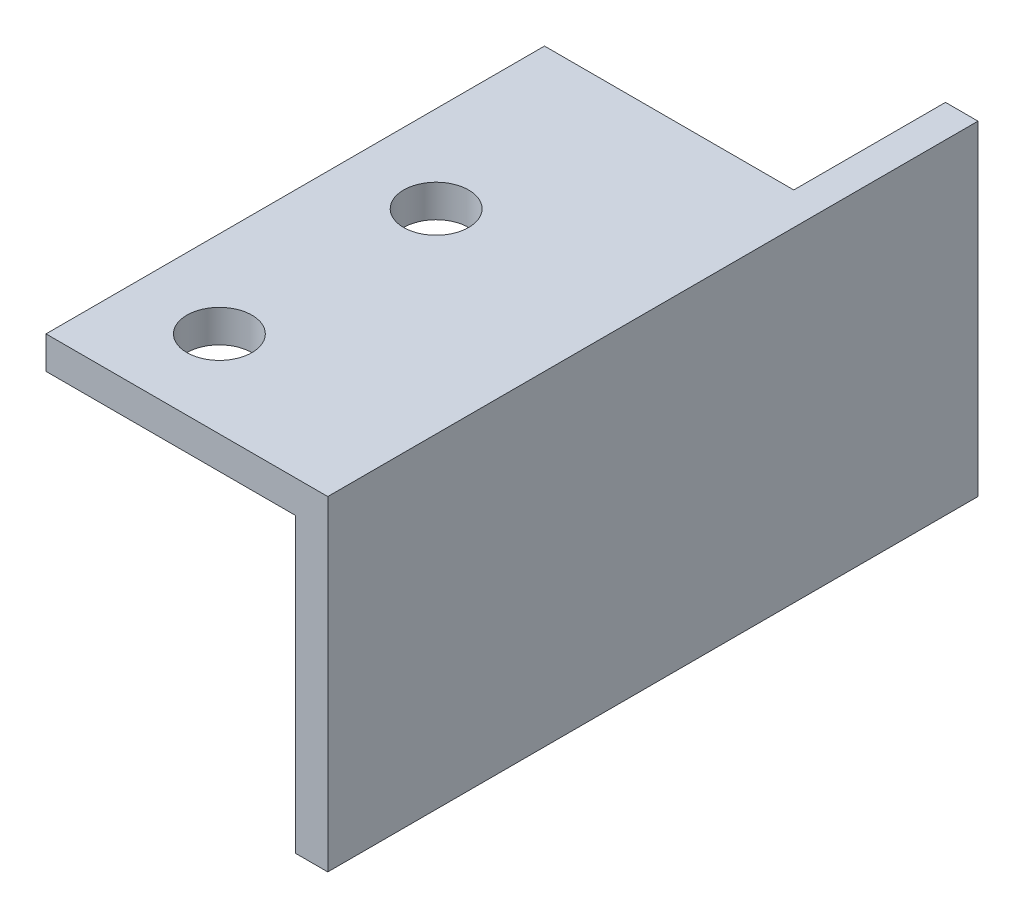
ISO-10303-21;
HEADER;
FILE_DESCRIPTION(('STEP AP214'),'2;1');
FILE_NAME('part.step','',(''),(''),'','','');
FILE_SCHEMA(('AUTOMOTIVE_DESIGN { 1 0 10303 214 1 1 1 1 }'));
ENDSEC;
DATA;
#1=APPLICATION_CONTEXT('core data for automotive mechanical design processes');
#2=APPLICATION_PROTOCOL_DEFINITION('international standard','automotive_design',2000,#1);
#3=PRODUCT_CONTEXT('',#1,'mechanical');
#4=PRODUCT('Part','Part','',(#3));
#5=PRODUCT_RELATED_PRODUCT_CATEGORY('part','',(#4));
#6=PRODUCT_DEFINITION_FORMATION('','',#4);
#7=PRODUCT_DEFINITION_CONTEXT('part definition',#1,'design');
#8=PRODUCT_DEFINITION('design','',#6,#7);
#9=PRODUCT_DEFINITION_SHAPE('','',#8);
#10=(LENGTH_UNIT() NAMED_UNIT(*) SI_UNIT(.MILLI.,.METRE.));
#11=(NAMED_UNIT(*) PLANE_ANGLE_UNIT() SI_UNIT($,.RADIAN.));
#12=(NAMED_UNIT(*) SI_UNIT($,.STERADIAN.) SOLID_ANGLE_UNIT());
#13=UNCERTAINTY_MEASURE_WITH_UNIT(LENGTH_MEASURE(1.E-05),#10,'distance_accuracy_value','');
#14=(GEOMETRIC_REPRESENTATION_CONTEXT(3) GLOBAL_UNCERTAINTY_ASSIGNED_CONTEXT((#13)) GLOBAL_UNIT_ASSIGNED_CONTEXT((#10,
#11,#12)) REPRESENTATION_CONTEXT('',''));
#15=CARTESIAN_POINT('',(0.,0.,0.));
#16=DIRECTION('',(0.,0.,1.));
#17=DIRECTION('',(1.,0.,0.));
#18=AXIS2_PLACEMENT_3D('',#15,#16,#17);
#19=CARTESIAN_POINT('',(-277.965646310861,896.941960338346,30.));
#20=DIRECTION('',(0.,1.,0.));
#21=DIRECTION('',(0.,0.,1.));
#22=AXIS2_PLACEMENT_3D('',#19,#20,#21);
#23=PLANE('',#22);
#24=DIRECTION('',(1.,0.,0.));
#25=VECTOR('',#24,1.);
#26=CARTESIAN_POINT('',(-277.965646310861,896.941960338346,0.));
#27=LINE('',#26,#25);
#28=CARTESIAN_POINT('',(-277.965646310861,896.941960338346,0.));
#29=VERTEX_POINT('',#28);
#30=CARTESIAN_POINT('',(-276.465646310861,896.941960338346,0.));
#31=VERTEX_POINT('',#30);
#32=EDGE_CURVE('E119',#29,#31,#27,.T.);
#33=ORIENTED_EDGE('',*,*,#32,.T.);
#34=DIRECTION('',(0.,0.,-1.));
#35=VECTOR('',#34,1.);
#36=CARTESIAN_POINT('',(-276.465646310861,896.941960338346,30.));
#37=LINE('',#36,#35);
#38=CARTESIAN_POINT('',(-276.465646310861,896.941960338346,30.));
#39=VERTEX_POINT('',#38);
#40=EDGE_CURVE('E11',#39,#31,#37,.T.);
#41=ORIENTED_EDGE('',*,*,#40,.F.);
#42=DIRECTION('',(1.,0.,0.));
#43=VECTOR('',#42,1.);
#44=CARTESIAN_POINT('',(-277.965646310861,896.941960338346,30.));
#45=LINE('',#44,#43);
#46=CARTESIAN_POINT('',(-277.965646310861,896.941960338346,30.));
#47=VERTEX_POINT('',#46);
#48=EDGE_CURVE('E128',#47,#39,#45,.T.);
#49=ORIENTED_EDGE('',*,*,#48,.F.);
#50=DIRECTION('',(0.,0.,-1.));
#51=VECTOR('',#50,1.);
#52=CARTESIAN_POINT('',(-277.965646310861,896.941960338346,30.));
#53=LINE('',#52,#51);
#54=EDGE_CURVE('E74',#47,#29,#53,.T.);
#55=ORIENTED_EDGE('',*,*,#54,.T.);
#56=EDGE_LOOP('',(#33,#41,#49,#55));
#57=FACE_BOUND('',#56,.T.);
#58=ADVANCED_FACE('F31',(#57),#23,.F.);
#59=CARTESIAN_POINT('',(-276.465646310861,896.941960338346,30.));
#60=DIRECTION('',(-1.,0.,0.));
#61=DIRECTION('',(0.,0.,1.));
#62=AXIS2_PLACEMENT_3D('',#59,#60,#61);
#63=PLANE('',#62);
#64=DIRECTION('',(0.,1.,0.));
#65=VECTOR('',#64,1.);
#66=CARTESIAN_POINT('',(-276.465646310861,896.941960338346,0.));
#67=LINE('',#66,#65);
#68=CARTESIAN_POINT('',(-276.465646310861,911.941960338346,0.));
#69=VERTEX_POINT('',#68);
#70=EDGE_CURVE('E121',#31,#69,#67,.T.);
#71=ORIENTED_EDGE('',*,*,#70,.T.);
#72=DIRECTION('',(0.,0.,-1.));
#73=VECTOR('',#72,1.);
#74=CARTESIAN_POINT('',(-276.465646310861,911.941960338346,30.));
#75=LINE('',#74,#73);
#76=CARTESIAN_POINT('',(-276.465646310861,911.941960338346,30.));
#77=VERTEX_POINT('',#76);
#78=EDGE_CURVE('E39',#77,#69,#75,.T.);
#79=ORIENTED_EDGE('',*,*,#78,.F.);
#80=DIRECTION('',(0.,1.,0.));
#81=VECTOR('',#80,1.);
#82=CARTESIAN_POINT('',(-276.465646310861,896.941960338346,30.));
#83=LINE('',#82,#81);
#84=EDGE_CURVE('E81',#39,#77,#83,.T.);
#85=ORIENTED_EDGE('',*,*,#84,.F.);
#86=ORIENTED_EDGE('',*,*,#40,.T.);
#87=EDGE_LOOP('',(#71,#79,#85,#86));
#88=FACE_BOUND('',#87,.T.);
#89=ADVANCED_FACE('F148',(#88),#63,.F.);
#90=CARTESIAN_POINT('',(-276.465646310861,911.941960338346,30.));
#91=DIRECTION('',(0.,-1.,0.));
#92=DIRECTION('',(0.,0.,-1.));
#93=AXIS2_PLACEMENT_3D('',#90,#91,#92);
#94=PLANE('',#93);
#95=CARTESIAN_POINT('',(-285.465646310861,911.941960338346,26.));
#96=DIRECTION('',(0.,1.,0.));
#97=DIRECTION('',(0.,0.,1.));
#98=AXIS2_PLACEMENT_3D('',#95,#96,#97);
#99=CIRCLE('',#98,1.50000000000002);
#100=CARTESIAN_POINT('',(-285.465646310861,911.941960338346,27.5));
#101=VERTEX_POINT('',#100);
#102=EDGE_CURVE('E142',#101,#101,#99,.T.);
#103=ORIENTED_EDGE('',*,*,#102,.F.);
#104=EDGE_LOOP('',(#103));
#105=FACE_BOUND('',#104,.T.);
#106=CARTESIAN_POINT('',(-285.465646310861,911.941960338346,16.));
#107=DIRECTION('',(0.,1.,0.));
#108=DIRECTION('',(0.,0.,1.));
#109=AXIS2_PLACEMENT_3D('',#106,#107,#108);
#110=CIRCLE('',#109,1.50000000000002);
#111=CARTESIAN_POINT('',(-285.465646310861,911.941960338346,17.5));
#112=VERTEX_POINT('',#111);
#113=EDGE_CURVE('E134',#112,#112,#110,.T.);
#114=ORIENTED_EDGE('',*,*,#113,.F.);
#115=EDGE_LOOP('',(#114));
#116=FACE_BOUND('',#115,.T.);
#117=DIRECTION('',(-1.,0.,0.));
#118=VECTOR('',#117,1.);
#119=CARTESIAN_POINT('',(-276.465646310861,911.941960338346,0.));
#120=LINE('',#119,#118);
#121=CARTESIAN_POINT('',(-277.965646310861,911.941960338346,0.));
#122=VERTEX_POINT('',#121);
#123=EDGE_CURVE('E124',#69,#122,#120,.T.);
#124=ORIENTED_EDGE('',*,*,#123,.T.);
#125=DIRECTION('',(0.,0.,-1.));
#126=VECTOR('',#125,1.);
#127=CARTESIAN_POINT('',(-277.965646310861,911.941960338346,0.));
#128=LINE('',#127,#126);
#129=CARTESIAN_POINT('',(-277.965646310861,911.941960338346,7.));
#130=VERTEX_POINT('',#129);
#131=EDGE_CURVE('E170',#130,#122,#128,.T.);
#132=ORIENTED_EDGE('',*,*,#131,.F.);
#133=DIRECTION('',(1.,0.,0.));
#134=VECTOR('',#133,1.);
#135=CARTESIAN_POINT('',(-289.465646310861,911.941960338346,7.));
#136=LINE('',#135,#134);
#137=CARTESIAN_POINT('',(-289.465646310861,911.941960338346,7.));
#138=VERTEX_POINT('',#137);
#139=EDGE_CURVE('E155',#138,#130,#136,.T.);
#140=ORIENTED_EDGE('',*,*,#139,.F.);
#141=DIRECTION('',(0.,0.,-1.));
#142=VECTOR('',#141,1.);
#143=CARTESIAN_POINT('',(-289.465646310861,911.941960338346,30.));
#144=LINE('',#143,#142);
#145=CARTESIAN_POINT('',(-289.465646310861,911.941960338346,30.));
#146=VERTEX_POINT('',#145);
#147=EDGE_CURVE('E110',#146,#138,#144,.T.);
#148=ORIENTED_EDGE('',*,*,#147,.F.);
#149=DIRECTION('',(-1.,0.,0.));
#150=VECTOR('',#149,1.);
#151=CARTESIAN_POINT('',(-276.465646310861,911.941960338346,30.));
#152=LINE('',#151,#150);
#153=EDGE_CURVE('E97',#77,#146,#152,.T.);
#154=ORIENTED_EDGE('',*,*,#153,.F.);
#155=ORIENTED_EDGE('',*,*,#78,.T.);
#156=EDGE_LOOP('',(#124,#132,#140,#148,#154,#155));
#157=FACE_BOUND('',#156,.T.);
#158=ADVANCED_FACE('F150',(#105,#116,#157),#94,.F.);
#159=CARTESIAN_POINT('',(-289.465646310861,911.941960338346,30.));
#160=DIRECTION('',(1.,0.,0.));
#161=DIRECTION('',(0.,0.,-1.));
#162=AXIS2_PLACEMENT_3D('',#159,#160,#161);
#163=PLANE('',#162);
#164=ORIENTED_EDGE('',*,*,#147,.T.);
#165=DIRECTION('',(0.,1.,0.));
#166=VECTOR('',#165,1.);
#167=CARTESIAN_POINT('',(-289.465646310861,881.941960338346,7.));
#168=LINE('',#167,#166);
#169=CARTESIAN_POINT('',(-289.465646310861,910.441960338346,7.));
#170=VERTEX_POINT('',#169);
#171=EDGE_CURVE('E107',#170,#138,#168,.T.);
#172=ORIENTED_EDGE('',*,*,#171,.F.);
#173=DIRECTION('',(0.,0.,-1.));
#174=VECTOR('',#173,1.);
#175=CARTESIAN_POINT('',(-289.465646310861,910.441960338346,30.));
#176=LINE('',#175,#174);
#177=CARTESIAN_POINT('',(-289.465646310861,910.441960338346,30.));
#178=VERTEX_POINT('',#177);
#179=EDGE_CURVE('E104',#178,#170,#176,.T.);
#180=ORIENTED_EDGE('',*,*,#179,.F.);
#181=DIRECTION('',(0.,-1.,0.));
#182=VECTOR('',#181,1.);
#183=CARTESIAN_POINT('',(-289.465646310861,911.941960338346,30.));
#184=LINE('',#183,#182);
#185=EDGE_CURVE('E90',#146,#178,#184,.T.);
#186=ORIENTED_EDGE('',*,*,#185,.F.);
#187=EDGE_LOOP('',(#164,#172,#180,#186));
#188=FACE_BOUND('',#187,.T.);
#189=ADVANCED_FACE('F105',(#188),#163,.F.);
#190=CARTESIAN_POINT('',(-289.465646310861,910.441960338346,30.));
#191=DIRECTION('',(0.,1.,0.));
#192=DIRECTION('',(0.,0.,1.));
#193=AXIS2_PLACEMENT_3D('',#190,#191,#192);
#194=PLANE('',#193);
#195=CARTESIAN_POINT('',(-285.465646310861,910.441960338346,26.));
#196=DIRECTION('',(0.,1.,0.));
#197=DIRECTION('',(0.,0.,1.));
#198=AXIS2_PLACEMENT_3D('',#195,#196,#197);
#199=CIRCLE('',#198,1.50000000000002);
#200=CARTESIAN_POINT('',(-285.465646310861,910.441960338346,27.5));
#201=VERTEX_POINT('',#200);
#202=EDGE_CURVE('E34',#201,#201,#199,.T.);
#203=ORIENTED_EDGE('',*,*,#202,.T.);
#204=EDGE_LOOP('',(#203));
#205=FACE_BOUND('',#204,.T.);
#206=CARTESIAN_POINT('',(-285.465646310861,910.441960338346,16.));
#207=DIRECTION('',(0.,1.,0.));
#208=DIRECTION('',(0.,0.,1.));
#209=AXIS2_PLACEMENT_3D('',#206,#207,#208);
#210=CIRCLE('',#209,1.50000000000002);
#211=CARTESIAN_POINT('',(-285.465646310861,910.441960338346,17.5));
#212=VERTEX_POINT('',#211);
#213=EDGE_CURVE('E122',#212,#212,#210,.T.);
#214=ORIENTED_EDGE('',*,*,#213,.T.);
#215=EDGE_LOOP('',(#214));
#216=FACE_BOUND('',#215,.T.);
#217=ORIENTED_EDGE('',*,*,#179,.T.);
#218=DIRECTION('',(1.,0.,0.));
#219=VECTOR('',#218,1.);
#220=CARTESIAN_POINT('',(-289.465646310861,910.441960338346,7.));
#221=LINE('',#220,#219);
#222=CARTESIAN_POINT('',(-277.965646310861,910.441960338346,7.));
#223=VERTEX_POINT('',#222);
#224=EDGE_CURVE('E165',#170,#223,#221,.T.);
#225=ORIENTED_EDGE('',*,*,#224,.T.);
#226=DIRECTION('',(0.,0.,-1.));
#227=VECTOR('',#226,1.);
#228=CARTESIAN_POINT('',(-277.965646310861,910.441960338346,30.));
#229=LINE('',#228,#227);
#230=CARTESIAN_POINT('',(-277.965646310861,910.441960338346,30.));
#231=VERTEX_POINT('',#230);
#232=EDGE_CURVE('E111',#231,#223,#229,.T.);
#233=ORIENTED_EDGE('',*,*,#232,.F.);
#234=DIRECTION('',(1.,0.,0.));
#235=VECTOR('',#234,1.);
#236=CARTESIAN_POINT('',(-289.465646310861,910.441960338346,30.));
#237=LINE('',#236,#235);
#238=EDGE_CURVE('E94',#178,#231,#237,.T.);
#239=ORIENTED_EDGE('',*,*,#238,.F.);
#240=EDGE_LOOP('',(#217,#225,#233,#239));
#241=FACE_BOUND('',#240,.T.);
#242=ADVANCED_FACE('F113',(#205,#216,#241),#194,.F.);
#243=CARTESIAN_POINT('',(-277.965646310861,910.441960338346,30.));
#244=DIRECTION('',(1.,0.,0.));
#245=DIRECTION('',(0.,0.,-1.));
#246=AXIS2_PLACEMENT_3D('',#243,#244,#245);
#247=PLANE('',#246);
#248=ORIENTED_EDGE('',*,*,#232,.T.);
#249=DIRECTION('',(0.,1.,0.));
#250=VECTOR('',#249,1.);
#251=CARTESIAN_POINT('',(-277.965646310861,881.941960338346,7.));
#252=LINE('',#251,#250);
#253=EDGE_CURVE('E164',#223,#130,#252,.T.);
#254=ORIENTED_EDGE('',*,*,#253,.T.);
#255=ORIENTED_EDGE('',*,*,#131,.T.);
#256=DIRECTION('',(0.,-1.,0.));
#257=VECTOR('',#256,1.);
#258=CARTESIAN_POINT('',(-277.965646310861,910.441960338346,0.));
#259=LINE('',#258,#257);
#260=EDGE_CURVE('E47',#122,#29,#259,.T.);
#261=ORIENTED_EDGE('',*,*,#260,.T.);
#262=ORIENTED_EDGE('',*,*,#54,.F.);
#263=DIRECTION('',(0.,-1.,0.));
#264=VECTOR('',#263,1.);
#265=CARTESIAN_POINT('',(-277.965646310861,910.441960338346,30.));
#266=LINE('',#265,#264);
#267=EDGE_CURVE('E56',#231,#47,#266,.T.);
#268=ORIENTED_EDGE('',*,*,#267,.F.);
#269=EDGE_LOOP('',(#248,#254,#255,#261,#262,#268));
#270=FACE_BOUND('',#269,.T.);
#271=ADVANCED_FACE('F174',(#270),#247,.F.);
#272=CARTESIAN_POINT('',(-276.465646310861,896.941960338346,30.));
#273=DIRECTION('',(0.,0.,1.));
#274=DIRECTION('',(1.,0.,0.));
#275=AXIS2_PLACEMENT_3D('',#272,#273,#274);
#276=PLANE('',#275);
#277=ORIENTED_EDGE('',*,*,#48,.T.);
#278=ORIENTED_EDGE('',*,*,#84,.T.);
#279=ORIENTED_EDGE('',*,*,#153,.T.);
#280=ORIENTED_EDGE('',*,*,#185,.T.);
#281=ORIENTED_EDGE('',*,*,#238,.T.);
#282=ORIENTED_EDGE('',*,*,#267,.T.);
#283=EDGE_LOOP('',(#277,#278,#279,#280,#281,#282));
#284=FACE_BOUND('',#283,.T.);
#285=ADVANCED_FACE('F92',(#284),#276,.T.);
#286=CARTESIAN_POINT('',(-276.465646310861,896.941960338346,0.));
#287=DIRECTION('',(0.,0.,1.));
#288=DIRECTION('',(1.,0.,0.));
#289=AXIS2_PLACEMENT_3D('',#286,#287,#288);
#290=PLANE('',#289);
#291=ORIENTED_EDGE('',*,*,#260,.F.);
#292=ORIENTED_EDGE('',*,*,#123,.F.);
#293=ORIENTED_EDGE('',*,*,#70,.F.);
#294=ORIENTED_EDGE('',*,*,#32,.F.);
#295=EDGE_LOOP('',(#291,#292,#293,#294));
#296=FACE_BOUND('',#295,.T.);
#297=ADVANCED_FACE('F175',(#296),#290,.F.);
#298=CARTESIAN_POINT('',(-285.465646310861,881.941960338346,16.));
#299=DIRECTION('',(0.,1.,0.));
#300=DIRECTION('',(0.,0.,1.));
#301=AXIS2_PLACEMENT_3D('',#298,#299,#300);
#302=CYLINDRICAL_SURFACE('',#301,1.50000000000002);
#303=ORIENTED_EDGE('',*,*,#113,.T.);
#304=EDGE_LOOP('',(#303));
#305=FACE_BOUND('',#304,.T.);
#306=ORIENTED_EDGE('',*,*,#213,.F.);
#307=EDGE_LOOP('',(#306));
#308=FACE_BOUND('',#307,.T.);
#309=ADVANCED_FACE('F177',(#305,#308),#302,.F.);
#310=CARTESIAN_POINT('',(-285.465646310861,881.941960338346,26.));
#311=DIRECTION('',(0.,1.,0.));
#312=DIRECTION('',(0.,0.,1.));
#313=AXIS2_PLACEMENT_3D('',#310,#311,#312);
#314=CYLINDRICAL_SURFACE('',#313,1.50000000000002);
#315=ORIENTED_EDGE('',*,*,#102,.T.);
#316=EDGE_LOOP('',(#315));
#317=FACE_BOUND('',#316,.T.);
#318=ORIENTED_EDGE('',*,*,#202,.F.);
#319=EDGE_LOOP('',(#318));
#320=FACE_BOUND('',#319,.T.);
#321=ADVANCED_FACE('F183',(#317,#320),#314,.F.);
#322=CARTESIAN_POINT('',(-289.465646310861,881.941960338346,7.));
#323=DIRECTION('',(0.,0.,1.));
#324=DIRECTION('',(1.,0.,0.));
#325=AXIS2_PLACEMENT_3D('',#322,#323,#324);
#326=PLANE('',#325);
#327=ORIENTED_EDGE('',*,*,#171,.T.);
#328=ORIENTED_EDGE('',*,*,#139,.T.);
#329=ORIENTED_EDGE('',*,*,#253,.F.);
#330=ORIENTED_EDGE('',*,*,#224,.F.);
#331=EDGE_LOOP('',(#327,#328,#329,#330));
#332=FACE_BOUND('',#331,.T.);
#333=ADVANCED_FACE('F166',(#332),#326,.F.);
#334=CLOSED_SHELL('',(#58,#89,#158,#189,#242,#271,#285,#297,#309,#321,#333));
#335=MANIFOLD_SOLID_BREP('B2',#334);
#336=ADVANCED_BREP_SHAPE_REPRESENTATION('',(#18,#335),#14);
#337=SHAPE_DEFINITION_REPRESENTATION(#9,#336);
ENDSEC;
END-ISO-10303-21;
